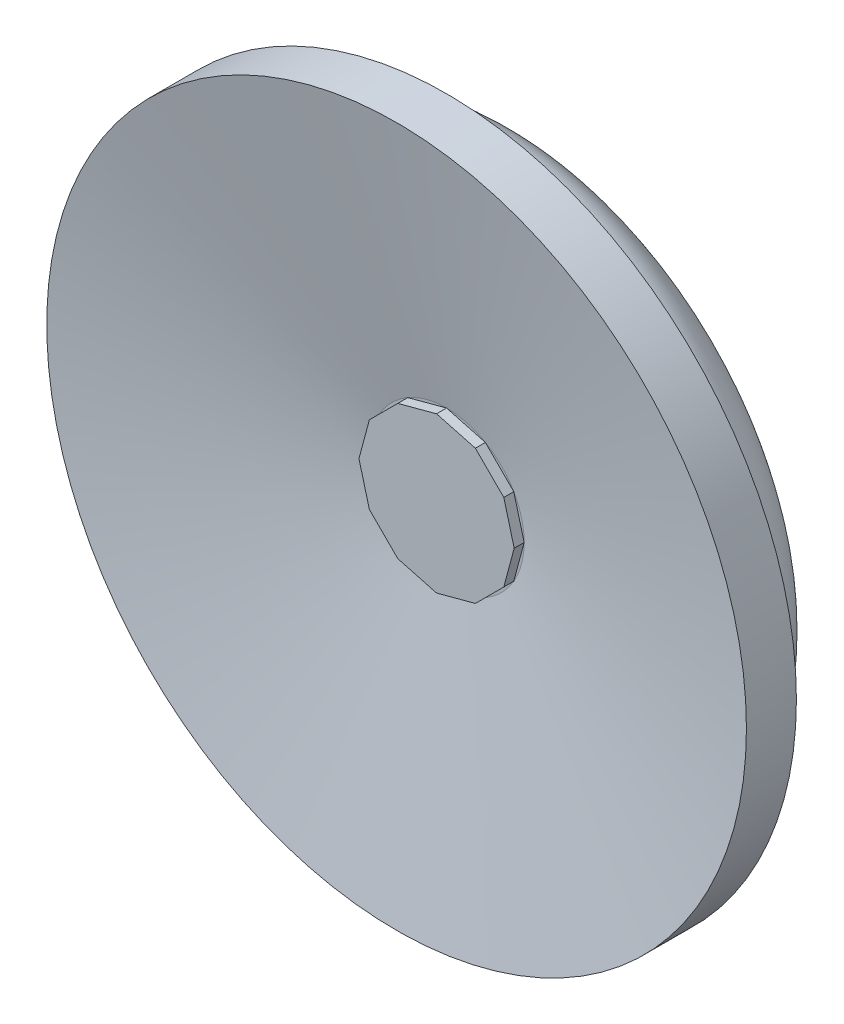
ISO-10303-21;
HEADER;
FILE_DESCRIPTION(('STEP AP214'),'2;1');
FILE_NAME('part.step','',(''),(''),'','','');
FILE_SCHEMA(('AUTOMOTIVE_DESIGN { 1 0 10303 214 1 1 1 1 }'));
ENDSEC;
DATA;
#1=APPLICATION_CONTEXT('core data for automotive mechanical design processes');
#2=APPLICATION_PROTOCOL_DEFINITION('international standard','automotive_design',2000,#1);
#3=PRODUCT_CONTEXT('',#1,'mechanical');
#4=PRODUCT('Part','Part','',(#3));
#5=PRODUCT_RELATED_PRODUCT_CATEGORY('part','',(#4));
#6=PRODUCT_DEFINITION_FORMATION('','',#4);
#7=PRODUCT_DEFINITION_CONTEXT('part definition',#1,'design');
#8=PRODUCT_DEFINITION('design','',#6,#7);
#9=PRODUCT_DEFINITION_SHAPE('','',#8);
#10=(LENGTH_UNIT() NAMED_UNIT(*) SI_UNIT(.MILLI.,.METRE.));
#11=(NAMED_UNIT(*) PLANE_ANGLE_UNIT() SI_UNIT($,.RADIAN.));
#12=(NAMED_UNIT(*) SI_UNIT($,.STERADIAN.) SOLID_ANGLE_UNIT());
#13=UNCERTAINTY_MEASURE_WITH_UNIT(LENGTH_MEASURE(1.E-05),#10,'distance_accuracy_value','');
#14=(GEOMETRIC_REPRESENTATION_CONTEXT(3) GLOBAL_UNCERTAINTY_ASSIGNED_CONTEXT((#13)) GLOBAL_UNIT_ASSIGNED_CONTEXT((#10,
#11,#12)) REPRESENTATION_CONTEXT('',''));
#15=CARTESIAN_POINT('',(0.,0.,0.));
#16=DIRECTION('',(0.,0.,1.));
#17=DIRECTION('',(1.,0.,0.));
#18=AXIS2_PLACEMENT_3D('',#15,#16,#17);
#19=CARTESIAN_POINT('',(0.,0.,-31.7));
#20=DIRECTION('',(0.,0.,1.));
#21=DIRECTION('',(1.,0.,0.));
#22=AXIS2_PLACEMENT_3D('',#19,#20,#21);
#23=CYLINDRICAL_SURFACE('',#22,2.);
#24=CARTESIAN_POINT('',(0.,0.,-27.6901588521357));
#25=DIRECTION('',(0.,0.,-1.));
#26=DIRECTION('',(-1.,0.,0.));
#27=AXIS2_PLACEMENT_3D('',#24,#25,#26);
#28=CIRCLE('',#27,2.);
#29=CARTESIAN_POINT('',(-2.,0.,-27.6901588521357));
#30=VERTEX_POINT('',#29);
#31=EDGE_CURVE('E11',#30,#30,#28,.F.);
#32=ORIENTED_EDGE('',*,*,#31,.T.);
#33=EDGE_LOOP('',(#32));
#34=FACE_BOUND('',#33,.T.);
#35=CARTESIAN_POINT('',(0.,0.,-25.));
#36=DIRECTION('',(0.,0.,1.));
#37=DIRECTION('',(1.,0.,0.));
#38=AXIS2_PLACEMENT_3D('',#35,#36,#37);
#39=CIRCLE('',#38,2.);
#40=CARTESIAN_POINT('',(2.,0.,-25.));
#41=VERTEX_POINT('',#40);
#42=EDGE_CURVE('E42',#41,#41,#39,.F.);
#43=ORIENTED_EDGE('',*,*,#42,.T.);
#44=EDGE_LOOP('',(#43));
#45=FACE_BOUND('',#44,.T.);
#46=ADVANCED_FACE('F34',(#34,#45),#23,.T.);
#47=CARTESIAN_POINT('',(0.,0.,0.));
#48=DIRECTION('',(0.,0.,1.));
#49=DIRECTION('',(1.,0.,0.));
#50=AXIS2_PLACEMENT_3D('',#47,#48,#49);
#51=PLANE('',#50);
#52=CARTESIAN_POINT('',(-1.73038666728687E-13,0.,0.));
#53=DIRECTION('',(0.,0.,1.));
#54=DIRECTION('',(1.,0.,0.));
#55=AXIS2_PLACEMENT_3D('',#52,#53,#54);
#56=CIRCLE('',#55,15.529142706151);
#57=CARTESIAN_POINT('',(7.76457135307521,13.4486320825208,0.));
#58=VERTEX_POINT('',#57);
#59=CARTESIAN_POINT('',(-3.49546780409327E-13,15.529142706151,0.));
#60=VERTEX_POINT('',#59);
#61=EDGE_CURVE('E620',#58,#60,#56,.T.);
#62=ORIENTED_EDGE('',*,*,#61,.T.);
#63=DIRECTION('',(-0.965925826289074,0.258819045102499,0.));
#64=VECTOR('',#63,1.);
#65=CARTESIAN_POINT('',(7.76457135307521,13.4486320825208,0.));
#66=LINE('',#65,#64);
#67=EDGE_CURVE('E154',#58,#60,#66,.T.);
#68=ORIENTED_EDGE('',*,*,#67,.F.);
#69=EDGE_LOOP('',(#62,#68));
#70=FACE_BOUND('',#69,.T.);
#71=ADVANCED_FACE('F243',(#70),#51,.T.);
#72=CARTESIAN_POINT('',(-7.76457135307581,13.4486320825204,0.));
#73=VERTEX_POINT('',#72);
#74=EDGE_CURVE('E615',#60,#73,#56,.T.);
#75=ORIENTED_EDGE('',*,*,#74,.T.);
#76=DIRECTION('',(-0.965925826289062,-0.258819045102542,0.));
#77=VECTOR('',#76,1.);
#78=CARTESIAN_POINT('',(-3.49546780409327E-13,15.529142706151,0.));
#79=LINE('',#78,#77);
#80=EDGE_CURVE('E157',#60,#73,#79,.T.);
#81=ORIENTED_EDGE('',*,*,#80,.F.);
#82=EDGE_LOOP('',(#75,#81));
#83=FACE_BOUND('',#82,.T.);
#84=ADVANCED_FACE('F249',(#83),#51,.T.);
#85=CARTESIAN_POINT('',(-13.4486320825208,7.76457135307522,0.));
#86=VERTEX_POINT('',#85);
#87=EDGE_CURVE('E621',#73,#86,#56,.T.);
#88=ORIENTED_EDGE('',*,*,#87,.T.);
#89=DIRECTION('',(-0.707106781186532,-0.707106781186563,0.));
#90=VECTOR('',#89,1.);
#91=CARTESIAN_POINT('',(-7.76457135307581,13.4486320825204,0.));
#92=LINE('',#91,#90);
#93=EDGE_CURVE('E159',#73,#86,#92,.T.);
#94=ORIENTED_EDGE('',*,*,#93,.F.);
#95=EDGE_LOOP('',(#88,#94));
#96=FACE_BOUND('',#95,.T.);
#97=ADVANCED_FACE('F474',(#96),#51,.T.);
#98=CARTESIAN_POINT('',(-15.529142706151,-3.45209971719385E-13,0.));
#99=VERTEX_POINT('',#98);
#100=EDGE_CURVE('E623',#86,#99,#56,.T.);
#101=ORIENTED_EDGE('',*,*,#100,.T.);
#102=DIRECTION('',(-0.258819045102499,-0.965925826289074,0.));
#103=VECTOR('',#102,1.);
#104=CARTESIAN_POINT('',(-13.4486320825208,7.76457135307522,0.));
#105=LINE('',#104,#103);
#106=EDGE_CURVE('E161',#86,#99,#105,.T.);
#107=ORIENTED_EDGE('',*,*,#106,.F.);
#108=EDGE_LOOP('',(#101,#107));
#109=FACE_BOUND('',#108,.T.);
#110=ADVANCED_FACE('F467',(#109),#51,.T.);
#111=CARTESIAN_POINT('',(-13.4486320825204,-7.76457135307581,0.));
#112=VERTEX_POINT('',#111);
#113=EDGE_CURVE('E626',#99,#112,#56,.T.);
#114=ORIENTED_EDGE('',*,*,#113,.T.);
#115=DIRECTION('',(0.258819045102542,-0.965925826289062,0.));
#116=VECTOR('',#115,1.);
#117=CARTESIAN_POINT('',(-15.529142706151,-3.45209971719385E-13,0.));
#118=LINE('',#117,#116);
#119=EDGE_CURVE('E163',#99,#112,#118,.T.);
#120=ORIENTED_EDGE('',*,*,#119,.F.);
#121=EDGE_LOOP('',(#114,#120));
#122=FACE_BOUND('',#121,.T.);
#123=ADVANCED_FACE('F460',(#122),#51,.T.);
#124=CARTESIAN_POINT('',(-7.76457135307521,-13.4486320825208,0.));
#125=VERTEX_POINT('',#124);
#126=EDGE_CURVE('E630',#112,#125,#56,.T.);
#127=ORIENTED_EDGE('',*,*,#126,.T.);
#128=DIRECTION('',(0.707106781186563,-0.707106781186532,0.));
#129=VECTOR('',#128,1.);
#130=CARTESIAN_POINT('',(-13.4486320825204,-7.76457135307581,0.));
#131=LINE('',#130,#129);
#132=EDGE_CURVE('E165',#112,#125,#131,.T.);
#133=ORIENTED_EDGE('',*,*,#132,.F.);
#134=EDGE_LOOP('',(#127,#133));
#135=FACE_BOUND('',#134,.T.);
#136=ADVANCED_FACE('F453',(#135),#51,.T.);
#137=CARTESIAN_POINT('',(3.45823415185606E-13,-15.529142706151,0.));
#138=VERTEX_POINT('',#137);
#139=EDGE_CURVE('E634',#125,#138,#56,.T.);
#140=ORIENTED_EDGE('',*,*,#139,.T.);
#141=DIRECTION('',(0.965925826289074,-0.258819045102499,0.));
#142=VECTOR('',#141,1.);
#143=CARTESIAN_POINT('',(-7.76457135307521,-13.4486320825208,0.));
#144=LINE('',#143,#142);
#145=EDGE_CURVE('E167',#125,#138,#144,.T.);
#146=ORIENTED_EDGE('',*,*,#145,.F.);
#147=EDGE_LOOP('',(#140,#146));
#148=FACE_BOUND('',#147,.T.);
#149=ADVANCED_FACE('F446',(#148),#51,.T.);
#150=CARTESIAN_POINT('',(7.76457135307581,-13.4486320825204,0.));
#151=VERTEX_POINT('',#150);
#152=EDGE_CURVE('E638',#138,#151,#56,.T.);
#153=ORIENTED_EDGE('',*,*,#152,.T.);
#154=DIRECTION('',(0.965925826289063,0.258819045102542,0.));
#155=VECTOR('',#154,1.);
#156=CARTESIAN_POINT('',(3.45823415185606E-13,-15.529142706151,0.));
#157=LINE('',#156,#155);
#158=EDGE_CURVE('E169',#138,#151,#157,.T.);
#159=ORIENTED_EDGE('',*,*,#158,.F.);
#160=EDGE_LOOP('',(#153,#159));
#161=FACE_BOUND('',#160,.T.);
#162=ADVANCED_FACE('F439',(#161),#51,.T.);
#163=CARTESIAN_POINT('',(13.4486320825208,-7.76457135307521,0.));
#164=VERTEX_POINT('',#163);
#165=EDGE_CURVE('E642',#151,#164,#56,.T.);
#166=ORIENTED_EDGE('',*,*,#165,.T.);
#167=DIRECTION('',(0.707106781186532,0.707106781186563,0.));
#168=VECTOR('',#167,1.);
#169=CARTESIAN_POINT('',(7.76457135307581,-13.4486320825204,0.));
#170=LINE('',#169,#168);
#171=EDGE_CURVE('E171',#151,#164,#170,.T.);
#172=ORIENTED_EDGE('',*,*,#171,.F.);
#173=EDGE_LOOP('',(#166,#172));
#174=FACE_BOUND('',#173,.T.);
#175=ADVANCED_FACE('F432',(#174),#51,.T.);
#176=CARTESIAN_POINT('',(15.529142706151,3.4399275281913E-13,0.));
#177=VERTEX_POINT('',#176);
#178=EDGE_CURVE('E207',#164,#177,#56,.T.);
#179=ORIENTED_EDGE('',*,*,#178,.T.);
#180=DIRECTION('',(0.258819045102499,0.965925826289074,0.));
#181=VECTOR('',#180,1.);
#182=CARTESIAN_POINT('',(13.4486320825208,-7.76457135307521,0.));
#183=LINE('',#182,#181);
#184=EDGE_CURVE('E143',#164,#177,#183,.T.);
#185=ORIENTED_EDGE('',*,*,#184,.F.);
#186=EDGE_LOOP('',(#179,#185));
#187=FACE_BOUND('',#186,.T.);
#188=ADVANCED_FACE('F425',(#187),#51,.T.);
#189=CARTESIAN_POINT('',(13.44863208252,7.76457135307621,0.));
#190=VERTEX_POINT('',#189);
#191=EDGE_CURVE('E208',#177,#190,#56,.T.);
#192=ORIENTED_EDGE('',*,*,#191,.T.);
#193=DIRECTION('',(-0.258819045102542,0.965925826289063,0.));
#194=VECTOR('',#193,1.);
#195=CARTESIAN_POINT('',(15.529142706151,3.4399275281913E-13,0.));
#196=LINE('',#195,#194);
#197=EDGE_CURVE('E174',#177,#190,#196,.T.);
#198=ORIENTED_EDGE('',*,*,#197,.F.);
#199=EDGE_LOOP('',(#192,#198));
#200=FACE_BOUND('',#199,.T.);
#201=ADVANCED_FACE('F418',(#200),#51,.T.);
#202=EDGE_CURVE('E212',#190,#58,#56,.T.);
#203=ORIENTED_EDGE('',*,*,#202,.T.);
#204=DIRECTION('',(-0.707106781186563,0.707106781186532,0.));
#205=VECTOR('',#204,1.);
#206=CARTESIAN_POINT('',(13.4486320825204,7.76457135307581,0.));
#207=LINE('',#206,#205);
#208=EDGE_CURVE('E95',#190,#58,#207,.T.);
#209=ORIENTED_EDGE('',*,*,#208,.F.);
#210=EDGE_LOOP('',(#203,#209));
#211=FACE_BOUND('',#210,.T.);
#212=ADVANCED_FACE('F252',(#211),#51,.T.);
#213=CARTESIAN_POINT('',(0.,0.,10.));
#214=DIRECTION('',(0.,0.,-1.));
#215=DIRECTION('',(-1.,0.,0.));
#216=AXIS2_PLACEMENT_3D('',#213,#214,#215);
#217=CYLINDRICAL_SURFACE('',#216,70.);
#218=CARTESIAN_POINT('',(-1.73038666728687E-13,0.,10.));
#219=DIRECTION('',(0.,0.,1.));
#220=DIRECTION('',(1.,0.,0.));
#221=AXIS2_PLACEMENT_3D('',#218,#219,#220);
#222=CIRCLE('',#221,69.9999999999999);
#223=CARTESIAN_POINT('',(69.9999999999997,0.,10.));
#224=VERTEX_POINT('',#223);
#225=EDGE_CURVE('E204',#224,#224,#222,.T.);
#226=ORIENTED_EDGE('',*,*,#225,.F.);
#227=EDGE_LOOP('',(#226));
#228=FACE_BOUND('',#227,.T.);
#229=CARTESIAN_POINT('',(0.,0.,0.));
#230=DIRECTION('',(0.,0.,1.));
#231=DIRECTION('',(1.,0.,0.));
#232=AXIS2_PLACEMENT_3D('',#229,#230,#231);
#233=CIRCLE('',#232,70.);
#234=CARTESIAN_POINT('',(70.,0.,0.));
#235=VERTEX_POINT('',#234);
#236=EDGE_CURVE('E215',#235,#235,#233,.T.);
#237=ORIENTED_EDGE('',*,*,#236,.T.);
#238=EDGE_LOOP('',(#237));
#239=FACE_BOUND('',#238,.T.);
#240=ADVANCED_FACE('F315',(#228,#239),#217,.T.);
#241=CARTESIAN_POINT('',(0.,0.,0.));
#242=DIRECTION('',(0.,0.,1.));
#243=DIRECTION('',(1.,0.,0.));
#244=AXIS2_PLACEMENT_3D('',#241,#242,#243);
#245=PLANE('',#244);
#246=CARTESIAN_POINT('',(0.,0.,0.));
#247=DIRECTION('',(0.,0.,1.));
#248=DIRECTION('',(1.,0.,0.));
#249=AXIS2_PLACEMENT_3D('',#246,#247,#248);
#250=CIRCLE('',#249,61.);
#251=CARTESIAN_POINT('',(61.,0.,0.));
#252=VERTEX_POINT('',#251);
#253=EDGE_CURVE('E211',#252,#252,#250,.T.);
#254=ORIENTED_EDGE('',*,*,#253,.T.);
#255=EDGE_LOOP('',(#254));
#256=FACE_BOUND('',#255,.T.);
#257=ORIENTED_EDGE('',*,*,#236,.F.);
#258=EDGE_LOOP('',(#257));
#259=FACE_BOUND('',#258,.T.);
#260=ADVANCED_FACE('F311',(#256,#259),#245,.F.);
#261=CARTESIAN_POINT('',(0.,0.,-15.));
#262=DIRECTION('',(0.,0.,1.));
#263=DIRECTION('',(1.,0.,0.));
#264=AXIS2_PLACEMENT_3D('',#261,#262,#263);
#265=CYLINDRICAL_SURFACE('',#264,61.);
#266=CARTESIAN_POINT('',(0.,0.,-5.));
#267=DIRECTION('',(0.,0.,1.));
#268=DIRECTION('',(1.,0.,0.));
#269=AXIS2_PLACEMENT_3D('',#266,#267,#268);
#270=CIRCLE('',#269,61.);
#271=CARTESIAN_POINT('',(61.,0.,-5.));
#272=VERTEX_POINT('',#271);
#273=EDGE_CURVE('E218',#272,#272,#270,.T.);
#274=ORIENTED_EDGE('',*,*,#273,.T.);
#275=EDGE_LOOP('',(#274));
#276=FACE_BOUND('',#275,.T.);
#277=ORIENTED_EDGE('',*,*,#253,.F.);
#278=EDGE_LOOP('',(#277));
#279=FACE_BOUND('',#278,.T.);
#280=ADVANCED_FACE('F307',(#276,#279),#265,.T.);
#281=CARTESIAN_POINT('',(0.,0.,-15.));
#282=DIRECTION('',(0.,0.,1.));
#283=DIRECTION('',(1.,0.,0.));
#284=AXIS2_PLACEMENT_3D('',#281,#282,#283);
#285=PLANE('',#284);
#286=CARTESIAN_POINT('',(0.,0.,-15.));
#287=DIRECTION('',(0.,0.,1.));
#288=DIRECTION('',(1.,0.,0.));
#289=AXIS2_PLACEMENT_3D('',#286,#287,#288);
#290=CIRCLE('',#289,51.);
#291=CARTESIAN_POINT('',(51.,0.,-15.));
#292=VERTEX_POINT('',#291);
#293=EDGE_CURVE('E224',#292,#292,#290,.F.);
#294=ORIENTED_EDGE('',*,*,#293,.T.);
#295=EDGE_LOOP('',(#294));
#296=FACE_BOUND('',#295,.T.);
#297=CARTESIAN_POINT('',(0.,0.,-15.));
#298=DIRECTION('',(0.,0.,1.));
#299=DIRECTION('',(1.,0.,0.));
#300=AXIS2_PLACEMENT_3D('',#297,#298,#299);
#301=CIRCLE('',#300,12.);
#302=CARTESIAN_POINT('',(12.,0.,-15.));
#303=VERTEX_POINT('',#302);
#304=EDGE_CURVE('E221',#303,#303,#301,.T.);
#305=ORIENTED_EDGE('',*,*,#304,.T.);
#306=EDGE_LOOP('',(#305));
#307=FACE_BOUND('',#306,.T.);
#308=ADVANCED_FACE('F302',(#296,#307),#285,.F.);
#309=CARTESIAN_POINT('',(-1.73038666728687E-13,0.,0.));
#310=DIRECTION('',(0.,0.,1.));
#311=DIRECTION('',(1.,0.,0.));
#312=AXIS2_PLACEMENT_3D('',#309,#310,#311);
#313=CONICAL_SURFACE('',#312,15.529142706151,1.3892336546202);
#314=ORIENTED_EDGE('',*,*,#225,.T.);
#315=EDGE_LOOP('',(#314));
#316=FACE_BOUND('',#315,.T.);
#317=ORIENTED_EDGE('',*,*,#191,.F.);
#318=ORIENTED_EDGE('',*,*,#178,.F.);
#319=ORIENTED_EDGE('',*,*,#165,.F.);
#320=ORIENTED_EDGE('',*,*,#152,.F.);
#321=ORIENTED_EDGE('',*,*,#139,.F.);
#322=ORIENTED_EDGE('',*,*,#126,.F.);
#323=ORIENTED_EDGE('',*,*,#113,.F.);
#324=ORIENTED_EDGE('',*,*,#100,.F.);
#325=ORIENTED_EDGE('',*,*,#87,.F.);
#326=ORIENTED_EDGE('',*,*,#74,.F.);
#327=ORIENTED_EDGE('',*,*,#61,.F.);
#328=ORIENTED_EDGE('',*,*,#202,.F.);
#329=EDGE_LOOP('',(#317,#318,#319,#320,#321,#322,#323,#324,#325,#326,#327,#328));
#330=FACE_BOUND('',#329,.T.);
#331=ADVANCED_FACE('F299',(#316,#330),#313,.F.);
#332=CARTESIAN_POINT('',(7.76457135307521,13.4486320825208,2.));
#333=DIRECTION('',(-0.258819045102499,-0.965925826289074,0.));
#334=DIRECTION('',(0.965925826289074,-0.258819045102499,0.));
#335=AXIS2_PLACEMENT_3D('',#332,#333,#334);
#336=PLANE('',#335);
#337=ORIENTED_EDGE('',*,*,#67,.T.);
#338=DIRECTION('',(0.,0.,-1.));
#339=VECTOR('',#338,1.);
#340=CARTESIAN_POINT('',(-3.49546780409327E-13,15.529142706151,2.));
#341=LINE('',#340,#339);
#342=CARTESIAN_POINT('',(-3.49546780409327E-13,15.529142706151,2.));
#343=VERTEX_POINT('',#342);
#344=EDGE_CURVE('E202',#343,#60,#341,.T.);
#345=ORIENTED_EDGE('',*,*,#344,.F.);
#346=DIRECTION('',(-0.965925826289074,0.258819045102499,0.));
#347=VECTOR('',#346,1.);
#348=CARTESIAN_POINT('',(7.76457135307521,13.4486320825208,2.));
#349=LINE('',#348,#347);
#350=CARTESIAN_POINT('',(7.76457135307521,13.4486320825208,2.));
#351=VERTEX_POINT('',#350);
#352=EDGE_CURVE('E177',#351,#343,#349,.T.);
#353=ORIENTED_EDGE('',*,*,#352,.F.);
#354=DIRECTION('',(0.,0.,-1.));
#355=VECTOR('',#354,1.);
#356=CARTESIAN_POINT('',(7.76457135307521,13.4486320825208,2.));
#357=LINE('',#356,#355);
#358=EDGE_CURVE('E150',#351,#58,#357,.T.);
#359=ORIENTED_EDGE('',*,*,#358,.T.);
#360=EDGE_LOOP('',(#337,#345,#353,#359));
#361=FACE_BOUND('',#360,.T.);
#362=ADVANCED_FACE('F296',(#361),#336,.F.);
#363=CARTESIAN_POINT('',(-3.49546780409327E-13,15.529142706151,2.));
#364=DIRECTION('',(0.258819045102542,-0.965925826289062,0.));
#365=DIRECTION('',(0.965925826289063,0.258819045102543,0.));
#366=AXIS2_PLACEMENT_3D('',#363,#364,#365);
#367=PLANE('',#366);
#368=ORIENTED_EDGE('',*,*,#80,.T.);
#369=DIRECTION('',(0.,0.,-1.));
#370=VECTOR('',#369,1.);
#371=CARTESIAN_POINT('',(-7.76457135307581,13.4486320825204,2.));
#372=LINE('',#371,#370);
#373=CARTESIAN_POINT('',(-7.76457135307581,13.4486320825204,2.));
#374=VERTEX_POINT('',#373);
#375=EDGE_CURVE('E199',#374,#73,#372,.T.);
#376=ORIENTED_EDGE('',*,*,#375,.F.);
#377=DIRECTION('',(-0.965925826289062,-0.258819045102542,0.));
#378=VECTOR('',#377,1.);
#379=CARTESIAN_POINT('',(-3.49546780409327E-13,15.529142706151,2.));
#380=LINE('',#379,#378);
#381=EDGE_CURVE('E103',#343,#374,#380,.T.);
#382=ORIENTED_EDGE('',*,*,#381,.F.);
#383=ORIENTED_EDGE('',*,*,#344,.T.);
#384=EDGE_LOOP('',(#368,#376,#382,#383));
#385=FACE_BOUND('',#384,.T.);
#386=ADVANCED_FACE('F292',(#385),#367,.F.);
#387=CARTESIAN_POINT('',(-7.76457135307581,13.4486320825204,2.));
#388=DIRECTION('',(0.707106781186563,-0.707106781186532,0.));
#389=DIRECTION('',(0.707106781186532,0.707106781186563,0.));
#390=AXIS2_PLACEMENT_3D('',#387,#388,#389);
#391=PLANE('',#390);
#392=ORIENTED_EDGE('',*,*,#93,.T.);
#393=DIRECTION('',(0.,0.,-1.));
#394=VECTOR('',#393,1.);
#395=CARTESIAN_POINT('',(-13.4486320825208,7.76457135307522,2.));
#396=LINE('',#395,#394);
#397=CARTESIAN_POINT('',(-13.4486320825208,7.76457135307522,2.));
#398=VERTEX_POINT('',#397);
#399=EDGE_CURVE('E196',#398,#86,#396,.T.);
#400=ORIENTED_EDGE('',*,*,#399,.F.);
#401=DIRECTION('',(-0.707106781186532,-0.707106781186563,0.));
#402=VECTOR('',#401,1.);
#403=CARTESIAN_POINT('',(-7.76457135307581,13.4486320825204,2.));
#404=LINE('',#403,#402);
#405=EDGE_CURVE('E657',#374,#398,#404,.T.);
#406=ORIENTED_EDGE('',*,*,#405,.F.);
#407=ORIENTED_EDGE('',*,*,#375,.T.);
#408=EDGE_LOOP('',(#392,#400,#406,#407));
#409=FACE_BOUND('',#408,.T.);
#410=ADVANCED_FACE('F288',(#409),#391,.F.);
#411=CARTESIAN_POINT('',(-13.4486320825208,7.76457135307522,2.));
#412=DIRECTION('',(0.965925826289074,-0.258819045102499,0.));
#413=DIRECTION('',(0.258819045102499,0.965925826289074,0.));
#414=AXIS2_PLACEMENT_3D('',#411,#412,#413);
#415=PLANE('',#414);
#416=ORIENTED_EDGE('',*,*,#106,.T.);
#417=DIRECTION('',(0.,0.,-1.));
#418=VECTOR('',#417,1.);
#419=CARTESIAN_POINT('',(-15.529142706151,-3.45209971719385E-13,2.));
#420=LINE('',#419,#418);
#421=CARTESIAN_POINT('',(-15.529142706151,-3.45209971719385E-13,2.));
#422=VERTEX_POINT('',#421);
#423=EDGE_CURVE('E193',#422,#99,#420,.T.);
#424=ORIENTED_EDGE('',*,*,#423,.F.);
#425=DIRECTION('',(-0.258819045102499,-0.965925826289074,0.));
#426=VECTOR('',#425,1.);
#427=CARTESIAN_POINT('',(-13.4486320825208,7.76457135307522,2.));
#428=LINE('',#427,#426);
#429=EDGE_CURVE('E661',#398,#422,#428,.T.);
#430=ORIENTED_EDGE('',*,*,#429,.F.);
#431=ORIENTED_EDGE('',*,*,#399,.T.);
#432=EDGE_LOOP('',(#416,#424,#430,#431));
#433=FACE_BOUND('',#432,.T.);
#434=ADVANCED_FACE('F284',(#433),#415,.F.);
#435=CARTESIAN_POINT('',(-15.529142706151,-3.45209971719385E-13,2.));
#436=DIRECTION('',(0.965925826289063,0.258819045102542,0.));
#437=DIRECTION('',(-0.258819045102542,0.965925826289063,0.));
#438=AXIS2_PLACEMENT_3D('',#435,#436,#437);
#439=PLANE('',#438);
#440=ORIENTED_EDGE('',*,*,#119,.T.);
#441=DIRECTION('',(0.,0.,-1.));
#442=VECTOR('',#441,1.);
#443=CARTESIAN_POINT('',(-13.4486320825204,-7.76457135307581,2.));
#444=LINE('',#443,#442);
#445=CARTESIAN_POINT('',(-13.4486320825204,-7.76457135307581,2.));
#446=VERTEX_POINT('',#445);
#447=EDGE_CURVE('E190',#446,#112,#444,.T.);
#448=ORIENTED_EDGE('',*,*,#447,.F.);
#449=DIRECTION('',(0.258819045102542,-0.965925826289062,0.));
#450=VECTOR('',#449,1.);
#451=CARTESIAN_POINT('',(-15.529142706151,-3.45209971719385E-13,2.));
#452=LINE('',#451,#450);
#453=EDGE_CURVE('E663',#422,#446,#452,.T.);
#454=ORIENTED_EDGE('',*,*,#453,.F.);
#455=ORIENTED_EDGE('',*,*,#423,.T.);
#456=EDGE_LOOP('',(#440,#448,#454,#455));
#457=FACE_BOUND('',#456,.T.);
#458=ADVANCED_FACE('F280',(#457),#439,.F.);
#459=CARTESIAN_POINT('',(-13.4486320825204,-7.76457135307581,2.));
#460=DIRECTION('',(0.707106781186532,0.707106781186563,0.));
#461=DIRECTION('',(-0.707106781186563,0.707106781186532,0.));
#462=AXIS2_PLACEMENT_3D('',#459,#460,#461);
#463=PLANE('',#462);
#464=ORIENTED_EDGE('',*,*,#132,.T.);
#465=DIRECTION('',(0.,0.,-1.));
#466=VECTOR('',#465,1.);
#467=CARTESIAN_POINT('',(-7.76457135307521,-13.4486320825208,2.));
#468=LINE('',#467,#466);
#469=CARTESIAN_POINT('',(-7.76457135307521,-13.4486320825208,2.));
#470=VERTEX_POINT('',#469);
#471=EDGE_CURVE('E187',#470,#125,#468,.T.);
#472=ORIENTED_EDGE('',*,*,#471,.F.);
#473=DIRECTION('',(0.707106781186563,-0.707106781186532,0.));
#474=VECTOR('',#473,1.);
#475=CARTESIAN_POINT('',(-13.4486320825204,-7.76457135307581,2.));
#476=LINE('',#475,#474);
#477=EDGE_CURVE('E665',#446,#470,#476,.T.);
#478=ORIENTED_EDGE('',*,*,#477,.F.);
#479=ORIENTED_EDGE('',*,*,#447,.T.);
#480=EDGE_LOOP('',(#464,#472,#478,#479));
#481=FACE_BOUND('',#480,.T.);
#482=ADVANCED_FACE('F276',(#481),#463,.F.);
#483=CARTESIAN_POINT('',(-7.76457135307521,-13.4486320825208,2.));
#484=DIRECTION('',(0.258819045102499,0.965925826289074,0.));
#485=DIRECTION('',(-0.965925826289074,0.258819045102499,0.));
#486=AXIS2_PLACEMENT_3D('',#483,#484,#485);
#487=PLANE('',#486);
#488=ORIENTED_EDGE('',*,*,#145,.T.);
#489=DIRECTION('',(0.,0.,-1.));
#490=VECTOR('',#489,1.);
#491=CARTESIAN_POINT('',(3.45823415185606E-13,-15.529142706151,2.));
#492=LINE('',#491,#490);
#493=CARTESIAN_POINT('',(3.45823415185606E-13,-15.529142706151,2.));
#494=VERTEX_POINT('',#493);
#495=EDGE_CURVE('E184',#494,#138,#492,.T.);
#496=ORIENTED_EDGE('',*,*,#495,.F.);
#497=DIRECTION('',(0.965925826289074,-0.258819045102499,0.));
#498=VECTOR('',#497,1.);
#499=CARTESIAN_POINT('',(-7.76457135307521,-13.4486320825208,2.));
#500=LINE('',#499,#498);
#501=EDGE_CURVE('E667',#470,#494,#500,.T.);
#502=ORIENTED_EDGE('',*,*,#501,.F.);
#503=ORIENTED_EDGE('',*,*,#471,.T.);
#504=EDGE_LOOP('',(#488,#496,#502,#503));
#505=FACE_BOUND('',#504,.T.);
#506=ADVANCED_FACE('F272',(#505),#487,.F.);
#507=CARTESIAN_POINT('',(3.45823415185606E-13,-15.529142706151,2.));
#508=DIRECTION('',(-0.258819045102542,0.965925826289063,0.));
#509=DIRECTION('',(-0.965925826289063,-0.258819045102542,0.));
#510=AXIS2_PLACEMENT_3D('',#507,#508,#509);
#511=PLANE('',#510);
#512=ORIENTED_EDGE('',*,*,#158,.T.);
#513=DIRECTION('',(0.,0.,-1.));
#514=VECTOR('',#513,1.);
#515=CARTESIAN_POINT('',(7.76457135307581,-13.4486320825204,2.));
#516=LINE('',#515,#514);
#517=CARTESIAN_POINT('',(7.76457135307581,-13.4486320825204,2.));
#518=VERTEX_POINT('',#517);
#519=EDGE_CURVE('E181',#518,#151,#516,.T.);
#520=ORIENTED_EDGE('',*,*,#519,.F.);
#521=DIRECTION('',(0.965925826289063,0.258819045102542,0.));
#522=VECTOR('',#521,1.);
#523=CARTESIAN_POINT('',(3.45823415185606E-13,-15.529142706151,2.));
#524=LINE('',#523,#522);
#525=EDGE_CURVE('E669',#494,#518,#524,.T.);
#526=ORIENTED_EDGE('',*,*,#525,.F.);
#527=ORIENTED_EDGE('',*,*,#495,.T.);
#528=EDGE_LOOP('',(#512,#520,#526,#527));
#529=FACE_BOUND('',#528,.T.);
#530=ADVANCED_FACE('F268',(#529),#511,.F.);
#531=CARTESIAN_POINT('',(7.76457135307581,-13.4486320825204,2.));
#532=DIRECTION('',(-0.707106781186563,0.707106781186532,0.));
#533=DIRECTION('',(-0.707106781186532,-0.707106781186563,0.));
#534=AXIS2_PLACEMENT_3D('',#531,#532,#533);
#535=PLANE('',#534);
#536=ORIENTED_EDGE('',*,*,#171,.T.);
#537=DIRECTION('',(0.,0.,-1.));
#538=VECTOR('',#537,1.);
#539=CARTESIAN_POINT('',(13.4486320825208,-7.76457135307521,2.));
#540=LINE('',#539,#538);
#541=CARTESIAN_POINT('',(13.4486320825208,-7.76457135307521,2.));
#542=VERTEX_POINT('',#541);
#543=EDGE_CURVE('E146',#542,#164,#540,.T.);
#544=ORIENTED_EDGE('',*,*,#543,.F.);
#545=DIRECTION('',(0.707106781186532,0.707106781186563,0.));
#546=VECTOR('',#545,1.);
#547=CARTESIAN_POINT('',(7.76457135307581,-13.4486320825204,2.));
#548=LINE('',#547,#546);
#549=EDGE_CURVE('E134',#518,#542,#548,.T.);
#550=ORIENTED_EDGE('',*,*,#549,.F.);
#551=ORIENTED_EDGE('',*,*,#519,.T.);
#552=EDGE_LOOP('',(#536,#544,#550,#551));
#553=FACE_BOUND('',#552,.T.);
#554=ADVANCED_FACE('F265',(#553),#535,.F.);
#555=CARTESIAN_POINT('',(13.4486320825208,-7.76457135307521,2.));
#556=DIRECTION('',(-0.965925826289074,0.258819045102499,0.));
#557=DIRECTION('',(-0.2588190451025,-0.965925826289074,0.));
#558=AXIS2_PLACEMENT_3D('',#555,#556,#557);
#559=PLANE('',#558);
#560=ORIENTED_EDGE('',*,*,#184,.T.);
#561=DIRECTION('',(0.,0.,-1.));
#562=VECTOR('',#561,1.);
#563=CARTESIAN_POINT('',(15.529142706151,3.4399275281913E-13,2.));
#564=LINE('',#563,#562);
#565=CARTESIAN_POINT('',(15.529142706151,3.4399275281913E-13,2.));
#566=VERTEX_POINT('',#565);
#567=EDGE_CURVE('E140',#566,#177,#564,.T.);
#568=ORIENTED_EDGE('',*,*,#567,.F.);
#569=DIRECTION('',(0.258819045102499,0.965925826289074,0.));
#570=VECTOR('',#569,1.);
#571=CARTESIAN_POINT('',(13.4486320825208,-7.76457135307521,2.));
#572=LINE('',#571,#570);
#573=EDGE_CURVE('E128',#542,#566,#572,.T.);
#574=ORIENTED_EDGE('',*,*,#573,.F.);
#575=ORIENTED_EDGE('',*,*,#543,.T.);
#576=EDGE_LOOP('',(#560,#568,#574,#575));
#577=FACE_BOUND('',#576,.T.);
#578=ADVANCED_FACE('F141',(#577),#559,.F.);
#579=CARTESIAN_POINT('',(15.529142706151,3.4399275281913E-13,2.));
#580=DIRECTION('',(-0.965925826289063,-0.258819045102542,0.));
#581=DIRECTION('',(0.258819045102542,-0.965925826289063,0.));
#582=AXIS2_PLACEMENT_3D('',#579,#580,#581);
#583=PLANE('',#582);
#584=ORIENTED_EDGE('',*,*,#197,.T.);
#585=DIRECTION('',(0.,0.,-1.));
#586=VECTOR('',#585,1.);
#587=CARTESIAN_POINT('',(13.4486320825204,7.76457135307581,2.));
#588=LINE('',#587,#586);
#589=CARTESIAN_POINT('',(13.4486320825204,7.76457135307581,2.));
#590=VERTEX_POINT('',#589);
#591=EDGE_CURVE('E49',#590,#190,#588,.T.);
#592=ORIENTED_EDGE('',*,*,#591,.F.);
#593=DIRECTION('',(-0.258819045102542,0.965925826289063,0.));
#594=VECTOR('',#593,1.);
#595=CARTESIAN_POINT('',(15.529142706151,3.4399275281913E-13,2.));
#596=LINE('',#595,#594);
#597=EDGE_CURVE('E132',#566,#590,#596,.T.);
#598=ORIENTED_EDGE('',*,*,#597,.F.);
#599=ORIENTED_EDGE('',*,*,#567,.T.);
#600=EDGE_LOOP('',(#584,#592,#598,#599));
#601=FACE_BOUND('',#600,.T.);
#602=ADVANCED_FACE('F148',(#601),#583,.F.);
#603=CARTESIAN_POINT('',(13.4486320825204,7.76457135307581,2.));
#604=DIRECTION('',(-0.707106781186532,-0.707106781186563,0.));
#605=DIRECTION('',(0.707106781186563,-0.707106781186532,0.));
#606=AXIS2_PLACEMENT_3D('',#603,#604,#605);
#607=PLANE('',#606);
#608=ORIENTED_EDGE('',*,*,#208,.T.);
#609=ORIENTED_EDGE('',*,*,#358,.F.);
#610=DIRECTION('',(-0.707106781186563,0.707106781186532,0.));
#611=VECTOR('',#610,1.);
#612=CARTESIAN_POINT('',(13.4486320825204,7.76457135307581,2.));
#613=LINE('',#612,#611);
#614=EDGE_CURVE('E57',#590,#351,#613,.T.);
#615=ORIENTED_EDGE('',*,*,#614,.F.);
#616=ORIENTED_EDGE('',*,*,#591,.T.);
#617=EDGE_LOOP('',(#608,#609,#615,#616));
#618=FACE_BOUND('',#617,.T.);
#619=ADVANCED_FACE('F258',(#618),#607,.F.);
#620=CARTESIAN_POINT('',(0.,0.,2.));
#621=DIRECTION('',(0.,0.,1.));
#622=DIRECTION('',(1.,0.,0.));
#623=AXIS2_PLACEMENT_3D('',#620,#621,#622);
#624=PLANE('',#623);
#625=ORIENTED_EDGE('',*,*,#352,.T.);
#626=ORIENTED_EDGE('',*,*,#381,.T.);
#627=ORIENTED_EDGE('',*,*,#405,.T.);
#628=ORIENTED_EDGE('',*,*,#429,.T.);
#629=ORIENTED_EDGE('',*,*,#453,.T.);
#630=ORIENTED_EDGE('',*,*,#477,.T.);
#631=ORIENTED_EDGE('',*,*,#501,.T.);
#632=ORIENTED_EDGE('',*,*,#525,.T.);
#633=ORIENTED_EDGE('',*,*,#549,.T.);
#634=ORIENTED_EDGE('',*,*,#573,.T.);
#635=ORIENTED_EDGE('',*,*,#597,.T.);
#636=ORIENTED_EDGE('',*,*,#614,.T.);
#637=EDGE_LOOP('',(#625,#626,#627,#628,#629,#630,#631,#632,#633,#634,#635,#636));
#638=FACE_BOUND('',#637,.T.);
#639=ADVANCED_FACE('F130',(#638),#624,.T.);
#640=CARTESIAN_POINT('',(0.,0.,-34.3));
#641=DIRECTION('',(0.,-1.,0.));
#642=DIRECTION('',(1.,0.,0.));
#643=AXIS2_PLACEMENT_3D('',#640,#641,#642);
#644=SPHERICAL_SURFACE('',#643,3.7);
#645=CARTESIAN_POINT('',(0.,0.,-34.3));
#646=DIRECTION('',(0.,0.,-1.));
#647=DIRECTION('',(-1.,0.,0.));
#648=AXIS2_PLACEMENT_3D('',#645,#646,#647);
#649=SPHERICAL_SURFACE('',#648,3.7);
#650=CARTESIAN_POINT('',(0.,0.,-32.5148604199199));
#651=DIRECTION('',(0.,0.,-1.));
#652=DIRECTION('',(-1.,0.,0.));
#653=AXIS2_PLACEMENT_3D('',#650,#651,#652);
#654=CIRCLE('',#653,3.24087591240876);
#655=CARTESIAN_POINT('',(-3.24087591240876,0.,-32.5148604199199));
#656=VERTEX_POINT('',#655);
#657=EDGE_CURVE('E227',#656,#656,#654,.T.);
#658=ORIENTED_EDGE('',*,*,#657,.T.);
#659=EDGE_LOOP('',(#658));
#660=FACE_BOUND('',#659,.T.);
#661=ADVANCED_FACE('F255',(#660),#649,.T.);
#662=CARTESIAN_POINT('',(0.,0.,-5.));
#663=DIRECTION('',(0.,0.,1.));
#664=DIRECTION('',(1.,0.,0.));
#665=AXIS2_PLACEMENT_3D('',#662,#663,#664);
#666=TOROIDAL_SURFACE('',#665,51.,10.);
#667=ORIENTED_EDGE('',*,*,#293,.F.);
#668=EDGE_LOOP('',(#667));
#669=FACE_BOUND('',#668,.T.);
#670=ORIENTED_EDGE('',*,*,#273,.F.);
#671=EDGE_LOOP('',(#670));
#672=FACE_BOUND('',#671,.T.);
#673=ADVANCED_FACE('F239',(#669,#672),#666,.T.);
#674=CARTESIAN_POINT('',(0.,0.,-27.6901588521357));
#675=DIRECTION('',(0.,0.,-1.));
#676=DIRECTION('',(-1.,0.,0.));
#677=AXIS2_PLACEMENT_3D('',#674,#675,#676);
#678=TOROIDAL_SURFACE('',#677,12.,10.);
#679=ORIENTED_EDGE('',*,*,#31,.F.);
#680=EDGE_LOOP('',(#679));
#681=FACE_BOUND('',#680,.T.);
#682=ORIENTED_EDGE('',*,*,#657,.F.);
#683=EDGE_LOOP('',(#682));
#684=FACE_BOUND('',#683,.T.);
#685=ADVANCED_FACE('F234',(#681,#684),#678,.F.);
#686=CARTESIAN_POINT('',(0.,0.,-25.));
#687=DIRECTION('',(0.,0.,1.));
#688=DIRECTION('',(1.,0.,0.));
#689=AXIS2_PLACEMENT_3D('',#686,#687,#688);
#690=TOROIDAL_SURFACE('',#689,12.,10.);
#691=ORIENTED_EDGE('',*,*,#304,.F.);
#692=EDGE_LOOP('',(#691));
#693=FACE_BOUND('',#692,.T.);
#694=ORIENTED_EDGE('',*,*,#42,.F.);
#695=EDGE_LOOP('',(#694));
#696=FACE_BOUND('',#695,.T.);
#697=ADVANCED_FACE('F36',(#693,#696),#690,.F.);
#698=CLOSED_SHELL('',(#46,#71,#84,#97,#110,#123,#136,#149,#162,#175,#188,#201,#212,#240,#260,
#280,#308,#331,#362,#386,#410,#434,#458,#482,#506,#530,#554,#578,#602,#619,#639,#661,#673,#685,#697));
#699=MANIFOLD_SOLID_BREP('B2',#698);
#700=ADVANCED_BREP_SHAPE_REPRESENTATION('',(#18,#699),#14);
#701=SHAPE_DEFINITION_REPRESENTATION(#9,#700);
ENDSEC;
END-ISO-10303-21;
